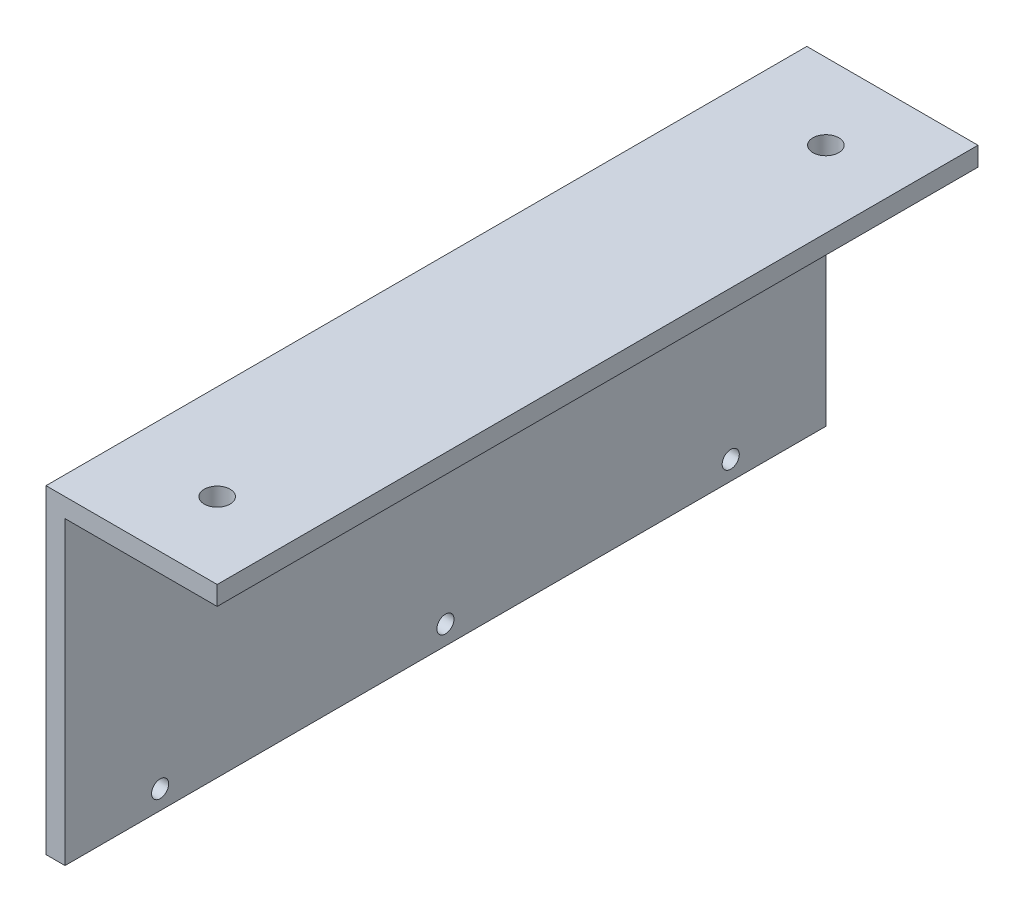
ISO-10303-21;
HEADER;
FILE_DESCRIPTION(('STEP AP214'),'2;1');
FILE_NAME('part.step','',(''),(''),'','','');
FILE_SCHEMA(('AUTOMOTIVE_DESIGN { 1 0 10303 214 1 1 1 1 }'));
ENDSEC;
DATA;
#1=APPLICATION_CONTEXT('core data for automotive mechanical design processes');
#2=APPLICATION_PROTOCOL_DEFINITION('international standard','automotive_design',2000,#1);
#3=PRODUCT_CONTEXT('',#1,'mechanical');
#4=PRODUCT('Part','Part','',(#3));
#5=PRODUCT_RELATED_PRODUCT_CATEGORY('part','',(#4));
#6=PRODUCT_DEFINITION_FORMATION('','',#4);
#7=PRODUCT_DEFINITION_CONTEXT('part definition',#1,'design');
#8=PRODUCT_DEFINITION('design','',#6,#7);
#9=PRODUCT_DEFINITION_SHAPE('','',#8);
#10=(LENGTH_UNIT() NAMED_UNIT(*) SI_UNIT(.MILLI.,.METRE.));
#11=(NAMED_UNIT(*) PLANE_ANGLE_UNIT() SI_UNIT($,.RADIAN.));
#12=(NAMED_UNIT(*) SI_UNIT($,.STERADIAN.) SOLID_ANGLE_UNIT());
#13=UNCERTAINTY_MEASURE_WITH_UNIT(LENGTH_MEASURE(1.E-05),#10,'distance_accuracy_value','');
#14=(GEOMETRIC_REPRESENTATION_CONTEXT(3) GLOBAL_UNCERTAINTY_ASSIGNED_CONTEXT((#13)) GLOBAL_UNIT_ASSIGNED_CONTEXT((#10,
#11,#12)) REPRESENTATION_CONTEXT('',''));
#15=CARTESIAN_POINT('',(0.,0.,0.));
#16=DIRECTION('',(0.,0.,1.));
#17=DIRECTION('',(1.,0.,0.));
#18=AXIS2_PLACEMENT_3D('',#15,#16,#17);
#19=CARTESIAN_POINT('',(0.,0.,200.));
#20=DIRECTION('',(0.,1.,0.));
#21=DIRECTION('',(0.,0.,1.));
#22=AXIS2_PLACEMENT_3D('',#19,#20,#21);
#23=PLANE('',#22);
#24=DIRECTION('',(1.,0.,0.));
#25=VECTOR('',#24,1.);
#26=CARTESIAN_POINT('',(0.,0.,0.));
#27=LINE('',#26,#25);
#28=CARTESIAN_POINT('',(0.,0.,0.));
#29=VERTEX_POINT('',#28);
#30=CARTESIAN_POINT('',(5.,0.,0.));
#31=VERTEX_POINT('',#30);
#32=EDGE_CURVE('E118',#29,#31,#27,.T.);
#33=ORIENTED_EDGE('',*,*,#32,.T.);
#34=DIRECTION('',(0.,0.,-1.));
#35=VECTOR('',#34,1.);
#36=CARTESIAN_POINT('',(5.,0.,200.));
#37=LINE('',#36,#35);
#38=CARTESIAN_POINT('',(5.,0.,200.));
#39=VERTEX_POINT('',#38);
#40=EDGE_CURVE('E11',#39,#31,#37,.T.);
#41=ORIENTED_EDGE('',*,*,#40,.F.);
#42=DIRECTION('',(1.,0.,0.));
#43=VECTOR('',#42,1.);
#44=CARTESIAN_POINT('',(0.,0.,200.));
#45=LINE('',#44,#43);
#46=CARTESIAN_POINT('',(0.,0.,200.));
#47=VERTEX_POINT('',#46);
#48=EDGE_CURVE('E129',#47,#39,#45,.T.);
#49=ORIENTED_EDGE('',*,*,#48,.F.);
#50=DIRECTION('',(0.,0.,-1.));
#51=VECTOR('',#50,1.);
#52=CARTESIAN_POINT('',(0.,0.,200.));
#53=LINE('',#52,#51);
#54=EDGE_CURVE('E114',#47,#29,#53,.T.);
#55=ORIENTED_EDGE('',*,*,#54,.T.);
#56=EDGE_LOOP('',(#33,#41,#49,#55));
#57=FACE_BOUND('',#56,.T.);
#58=ADVANCED_FACE('F34',(#57),#23,.F.);
#59=CARTESIAN_POINT('',(5.,0.,200.));
#60=DIRECTION('',(-1.,0.,0.));
#61=DIRECTION('',(0.,0.,1.));
#62=AXIS2_PLACEMENT_3D('',#59,#60,#61);
#63=PLANE('',#62);
#64=CARTESIAN_POINT('',(5.,5.00000000000002,175.000000000003));
#65=DIRECTION('',(-1.,0.,0.));
#66=DIRECTION('',(0.,0.,1.));
#67=AXIS2_PLACEMENT_3D('',#64,#65,#66);
#68=CIRCLE('',#67,2.24999999999999);
#69=CARTESIAN_POINT('',(5.,5.00000000000002,177.250000000003));
#70=VERTEX_POINT('',#69);
#71=EDGE_CURVE('E271',#70,#70,#68,.T.);
#72=ORIENTED_EDGE('',*,*,#71,.T.);
#73=EDGE_LOOP('',(#72));
#74=FACE_BOUND('',#73,.T.);
#75=CARTESIAN_POINT('',(5.,5.,100.));
#76=DIRECTION('',(-1.,0.,0.));
#77=DIRECTION('',(0.,0.,1.));
#78=AXIS2_PLACEMENT_3D('',#75,#76,#77);
#79=CIRCLE('',#78,2.24999999999999);
#80=CARTESIAN_POINT('',(5.,5.,102.25));
#81=VERTEX_POINT('',#80);
#82=EDGE_CURVE('E275',#81,#81,#79,.T.);
#83=ORIENTED_EDGE('',*,*,#82,.T.);
#84=EDGE_LOOP('',(#83));
#85=FACE_BOUND('',#84,.T.);
#86=CARTESIAN_POINT('',(5.,5.,24.9999999999969));
#87=DIRECTION('',(-1.,0.,0.));
#88=DIRECTION('',(0.,0.,1.));
#89=AXIS2_PLACEMENT_3D('',#86,#87,#88);
#90=CIRCLE('',#89,2.24999999999999);
#91=CARTESIAN_POINT('',(5.,5.,27.2499999999969));
#92=VERTEX_POINT('',#91);
#93=EDGE_CURVE('E284',#92,#92,#90,.T.);
#94=ORIENTED_EDGE('',*,*,#93,.T.);
#95=EDGE_LOOP('',(#94));
#96=FACE_BOUND('',#95,.T.);
#97=DIRECTION('',(0.,1.,0.));
#98=VECTOR('',#97,1.);
#99=CARTESIAN_POINT('',(5.,0.,0.));
#100=LINE('',#99,#98);
#101=CARTESIAN_POINT('',(5.,79.,0.));
#102=VERTEX_POINT('',#101);
#103=EDGE_CURVE('E121',#31,#102,#100,.T.);
#104=ORIENTED_EDGE('',*,*,#103,.T.);
#105=DIRECTION('',(0.,0.,-1.));
#106=VECTOR('',#105,1.);
#107=CARTESIAN_POINT('',(5.,79.,200.));
#108=LINE('',#107,#106);
#109=CARTESIAN_POINT('',(5.,79.,200.));
#110=VERTEX_POINT('',#109);
#111=EDGE_CURVE('E42',#110,#102,#108,.T.);
#112=ORIENTED_EDGE('',*,*,#111,.F.);
#113=DIRECTION('',(0.,1.,0.));
#114=VECTOR('',#113,1.);
#115=CARTESIAN_POINT('',(5.,0.,200.));
#116=LINE('',#115,#114);
#117=EDGE_CURVE('E87',#39,#110,#116,.T.);
#118=ORIENTED_EDGE('',*,*,#117,.F.);
#119=ORIENTED_EDGE('',*,*,#40,.T.);
#120=EDGE_LOOP('',(#104,#112,#118,#119));
#121=FACE_BOUND('',#120,.T.);
#122=ADVANCED_FACE('F157',(#74,#85,#96,#121),#63,.F.);
#123=CARTESIAN_POINT('',(5.,79.,200.));
#124=DIRECTION('',(0.,1.,0.));
#125=DIRECTION('',(0.,0.,1.));
#126=AXIS2_PLACEMENT_3D('',#123,#124,#125);
#127=PLANE('',#126);
#128=CARTESIAN_POINT('',(25.,79.,180.));
#129=DIRECTION('',(0.,-1.,0.));
#130=DIRECTION('',(0.,0.,-1.));
#131=AXIS2_PLACEMENT_3D('',#128,#129,#130);
#132=CIRCLE('',#131,3.39999999999999);
#133=CARTESIAN_POINT('',(25.,79.,176.6));
#134=VERTEX_POINT('',#133);
#135=EDGE_CURVE('E287',#134,#134,#132,.T.);
#136=ORIENTED_EDGE('',*,*,#135,.F.);
#137=EDGE_LOOP('',(#136));
#138=FACE_BOUND('',#137,.T.);
#139=CARTESIAN_POINT('',(25.,79.,20.));
#140=DIRECTION('',(0.,-1.,0.));
#141=DIRECTION('',(0.,0.,-1.));
#142=AXIS2_PLACEMENT_3D('',#139,#140,#141);
#143=CIRCLE('',#142,3.39999999999999);
#144=CARTESIAN_POINT('',(25.,79.,16.6));
#145=VERTEX_POINT('',#144);
#146=EDGE_CURVE('E293',#145,#145,#143,.T.);
#147=ORIENTED_EDGE('',*,*,#146,.F.);
#148=EDGE_LOOP('',(#147));
#149=FACE_BOUND('',#148,.T.);
#150=DIRECTION('',(1.,0.,0.));
#151=VECTOR('',#150,1.);
#152=CARTESIAN_POINT('',(5.,79.,0.));
#153=LINE('',#152,#151);
#154=CARTESIAN_POINT('',(45.,79.,0.));
#155=VERTEX_POINT('',#154);
#156=EDGE_CURVE('E124',#102,#155,#153,.T.);
#157=ORIENTED_EDGE('',*,*,#156,.T.);
#158=DIRECTION('',(0.,0.,-1.));
#159=VECTOR('',#158,1.);
#160=CARTESIAN_POINT('',(45.,79.,200.));
#161=LINE('',#160,#159);
#162=CARTESIAN_POINT('',(45.,79.,200.));
#163=VERTEX_POINT('',#162);
#164=EDGE_CURVE('E109',#163,#155,#161,.T.);
#165=ORIENTED_EDGE('',*,*,#164,.F.);
#166=DIRECTION('',(1.,0.,0.));
#167=VECTOR('',#166,1.);
#168=CARTESIAN_POINT('',(5.,79.,200.));
#169=LINE('',#168,#167);
#170=EDGE_CURVE('E100',#110,#163,#169,.T.);
#171=ORIENTED_EDGE('',*,*,#170,.F.);
#172=ORIENTED_EDGE('',*,*,#111,.T.);
#173=EDGE_LOOP('',(#157,#165,#171,#172));
#174=FACE_BOUND('',#173,.T.);
#175=ADVANCED_FACE('F135',(#138,#149,#174),#127,.F.);
#176=CARTESIAN_POINT('',(45.,79.,200.));
#177=DIRECTION('',(-1.,0.,0.));
#178=DIRECTION('',(0.,0.,1.));
#179=AXIS2_PLACEMENT_3D('',#176,#177,#178);
#180=PLANE('',#179);
#181=DIRECTION('',(0.,1.,0.));
#182=VECTOR('',#181,1.);
#183=CARTESIAN_POINT('',(45.,79.,0.));
#184=LINE('',#183,#182);
#185=CARTESIAN_POINT('',(45.,84.,0.));
#186=VERTEX_POINT('',#185);
#187=EDGE_CURVE('E108',#155,#186,#184,.T.);
#188=ORIENTED_EDGE('',*,*,#187,.T.);
#189=DIRECTION('',(0.,0.,-1.));
#190=VECTOR('',#189,1.);
#191=CARTESIAN_POINT('',(45.,84.,200.));
#192=LINE('',#191,#190);
#193=CARTESIAN_POINT('',(45.,84.,200.));
#194=VERTEX_POINT('',#193);
#195=EDGE_CURVE('E105',#194,#186,#192,.T.);
#196=ORIENTED_EDGE('',*,*,#195,.F.);
#197=DIRECTION('',(0.,1.,0.));
#198=VECTOR('',#197,1.);
#199=CARTESIAN_POINT('',(45.,79.,200.));
#200=LINE('',#199,#198);
#201=EDGE_CURVE('E94',#163,#194,#200,.T.);
#202=ORIENTED_EDGE('',*,*,#201,.F.);
#203=ORIENTED_EDGE('',*,*,#164,.T.);
#204=EDGE_LOOP('',(#188,#196,#202,#203));
#205=FACE_BOUND('',#204,.T.);
#206=ADVANCED_FACE('F106',(#205),#180,.F.);
#207=CARTESIAN_POINT('',(0.,84.,200.));
#208=DIRECTION('',(0.,-1.,0.));
#209=DIRECTION('',(0.,0.,-1.));
#210=AXIS2_PLACEMENT_3D('',#207,#208,#209);
#211=PLANE('',#210);
#212=CARTESIAN_POINT('',(25.,84.,180.));
#213=DIRECTION('',(0.,-1.,0.));
#214=DIRECTION('',(0.,0.,-1.));
#215=AXIS2_PLACEMENT_3D('',#212,#213,#214);
#216=CIRCLE('',#215,3.39999999999999);
#217=CARTESIAN_POINT('',(25.,84.,176.6));
#218=VERTEX_POINT('',#217);
#219=EDGE_CURVE('E290',#218,#218,#216,.T.);
#220=ORIENTED_EDGE('',*,*,#219,.T.);
#221=EDGE_LOOP('',(#220));
#222=FACE_BOUND('',#221,.T.);
#223=CARTESIAN_POINT('',(25.,84.,20.));
#224=DIRECTION('',(0.,-1.,0.));
#225=DIRECTION('',(0.,0.,-1.));
#226=AXIS2_PLACEMENT_3D('',#223,#224,#225);
#227=CIRCLE('',#226,3.39999999999999);
#228=CARTESIAN_POINT('',(25.,84.,16.6));
#229=VERTEX_POINT('',#228);
#230=EDGE_CURVE('E122',#229,#229,#227,.T.);
#231=ORIENTED_EDGE('',*,*,#230,.T.);
#232=EDGE_LOOP('',(#231));
#233=FACE_BOUND('',#232,.T.);
#234=DIRECTION('',(-1.,0.,0.));
#235=VECTOR('',#234,1.);
#236=CARTESIAN_POINT('',(0.,84.,0.));
#237=LINE('',#236,#235);
#238=CARTESIAN_POINT('',(0.,84.,0.));
#239=VERTEX_POINT('',#238);
#240=EDGE_CURVE('E73',#186,#239,#237,.T.);
#241=ORIENTED_EDGE('',*,*,#240,.T.);
#242=DIRECTION('',(0.,0.,-1.));
#243=VECTOR('',#242,1.);
#244=CARTESIAN_POINT('',(0.,84.,200.));
#245=LINE('',#244,#243);
#246=CARTESIAN_POINT('',(0.,84.,200.));
#247=VERTEX_POINT('',#246);
#248=EDGE_CURVE('E110',#247,#239,#245,.T.);
#249=ORIENTED_EDGE('',*,*,#248,.F.);
#250=DIRECTION('',(-1.,0.,0.));
#251=VECTOR('',#250,1.);
#252=CARTESIAN_POINT('',(0.,84.,200.));
#253=LINE('',#252,#251);
#254=EDGE_CURVE('E98',#194,#247,#253,.T.);
#255=ORIENTED_EDGE('',*,*,#254,.F.);
#256=ORIENTED_EDGE('',*,*,#195,.T.);
#257=EDGE_LOOP('',(#241,#249,#255,#256));
#258=FACE_BOUND('',#257,.T.);
#259=ADVANCED_FACE('F112',(#222,#233,#258),#211,.F.);
#260=CARTESIAN_POINT('',(0.,0.,200.));
#261=DIRECTION('',(1.,0.,0.));
#262=DIRECTION('',(0.,0.,-1.));
#263=AXIS2_PLACEMENT_3D('',#260,#261,#262);
#264=PLANE('',#263);
#265=CARTESIAN_POINT('',(0.,5.00000000000002,175.000000000003));
#266=DIRECTION('',(-1.,0.,0.));
#267=DIRECTION('',(0.,0.,1.));
#268=AXIS2_PLACEMENT_3D('',#265,#266,#267);
#269=CIRCLE('',#268,2.24999999999999);
#270=CARTESIAN_POINT('',(0.,5.00000000000002,177.250000000003));
#271=VERTEX_POINT('',#270);
#272=EDGE_CURVE('E269',#271,#271,#269,.T.);
#273=ORIENTED_EDGE('',*,*,#272,.F.);
#274=EDGE_LOOP('',(#273));
#275=FACE_BOUND('',#274,.T.);
#276=CARTESIAN_POINT('',(0.,5.,100.));
#277=DIRECTION('',(-1.,0.,0.));
#278=DIRECTION('',(0.,0.,1.));
#279=AXIS2_PLACEMENT_3D('',#276,#277,#278);
#280=CIRCLE('',#279,2.24999999999999);
#281=CARTESIAN_POINT('',(0.,5.,102.25));
#282=VERTEX_POINT('',#281);
#283=EDGE_CURVE('E272',#282,#282,#280,.T.);
#284=ORIENTED_EDGE('',*,*,#283,.F.);
#285=EDGE_LOOP('',(#284));
#286=FACE_BOUND('',#285,.T.);
#287=CARTESIAN_POINT('',(0.,5.,24.9999999999969));
#288=DIRECTION('',(-1.,0.,0.));
#289=DIRECTION('',(0.,0.,1.));
#290=AXIS2_PLACEMENT_3D('',#287,#288,#289);
#291=CIRCLE('',#290,2.24999999999999);
#292=CARTESIAN_POINT('',(0.,5.,27.2499999999969));
#293=VERTEX_POINT('',#292);
#294=EDGE_CURVE('E281',#293,#293,#291,.T.);
#295=ORIENTED_EDGE('',*,*,#294,.F.);
#296=EDGE_LOOP('',(#295));
#297=FACE_BOUND('',#296,.T.);
#298=DIRECTION('',(0.,-1.,0.));
#299=VECTOR('',#298,1.);
#300=CARTESIAN_POINT('',(0.,0.,0.));
#301=LINE('',#300,#299);
#302=EDGE_CURVE('E79',#239,#29,#301,.T.);
#303=ORIENTED_EDGE('',*,*,#302,.T.);
#304=ORIENTED_EDGE('',*,*,#54,.F.);
#305=DIRECTION('',(0.,-1.,0.));
#306=VECTOR('',#305,1.);
#307=CARTESIAN_POINT('',(0.,0.,200.));
#308=LINE('',#307,#306);
#309=EDGE_CURVE('E50',#247,#47,#308,.T.);
#310=ORIENTED_EDGE('',*,*,#309,.F.);
#311=ORIENTED_EDGE('',*,*,#248,.T.);
#312=EDGE_LOOP('',(#303,#304,#310,#311));
#313=FACE_BOUND('',#312,.T.);
#314=ADVANCED_FACE('F142',(#275,#286,#297,#313),#264,.F.);
#315=CARTESIAN_POINT('',(0.,0.,200.));
#316=DIRECTION('',(0.,0.,1.));
#317=DIRECTION('',(1.,0.,0.));
#318=AXIS2_PLACEMENT_3D('',#315,#316,#317);
#319=PLANE('',#318);
#320=ORIENTED_EDGE('',*,*,#48,.T.);
#321=ORIENTED_EDGE('',*,*,#117,.T.);
#322=ORIENTED_EDGE('',*,*,#170,.T.);
#323=ORIENTED_EDGE('',*,*,#201,.T.);
#324=ORIENTED_EDGE('',*,*,#254,.T.);
#325=ORIENTED_EDGE('',*,*,#309,.T.);
#326=EDGE_LOOP('',(#320,#321,#322,#323,#324,#325));
#327=FACE_BOUND('',#326,.T.);
#328=ADVANCED_FACE('F96',(#327),#319,.T.);
#329=CARTESIAN_POINT('',(0.,0.,0.));
#330=DIRECTION('',(0.,0.,1.));
#331=DIRECTION('',(1.,0.,0.));
#332=AXIS2_PLACEMENT_3D('',#329,#330,#331);
#333=PLANE('',#332);
#334=ORIENTED_EDGE('',*,*,#32,.F.);
#335=ORIENTED_EDGE('',*,*,#302,.F.);
#336=ORIENTED_EDGE('',*,*,#240,.F.);
#337=ORIENTED_EDGE('',*,*,#187,.F.);
#338=ORIENTED_EDGE('',*,*,#156,.F.);
#339=ORIENTED_EDGE('',*,*,#103,.F.);
#340=EDGE_LOOP('',(#334,#335,#336,#337,#338,#339));
#341=FACE_BOUND('',#340,.T.);
#342=ADVANCED_FACE('F138',(#341),#333,.F.);
#343=CARTESIAN_POINT('',(25.,79.,20.));
#344=DIRECTION('',(0.,-1.,0.));
#345=DIRECTION('',(0.,0.,-1.));
#346=AXIS2_PLACEMENT_3D('',#343,#344,#345);
#347=CYLINDRICAL_SURFACE('',#346,3.39999999999999);
#348=ORIENTED_EDGE('',*,*,#230,.F.);
#349=EDGE_LOOP('',(#348));
#350=FACE_BOUND('',#349,.T.);
#351=ORIENTED_EDGE('',*,*,#146,.T.);
#352=EDGE_LOOP('',(#351));
#353=FACE_BOUND('',#352,.T.);
#354=ADVANCED_FACE('F189',(#350,#353),#347,.F.);
#355=CARTESIAN_POINT('',(25.,79.,180.));
#356=DIRECTION('',(0.,-1.,0.));
#357=DIRECTION('',(0.,0.,-1.));
#358=AXIS2_PLACEMENT_3D('',#355,#356,#357);
#359=CYLINDRICAL_SURFACE('',#358,3.39999999999999);
#360=ORIENTED_EDGE('',*,*,#219,.F.);
#361=EDGE_LOOP('',(#360));
#362=FACE_BOUND('',#361,.T.);
#363=ORIENTED_EDGE('',*,*,#135,.T.);
#364=EDGE_LOOP('',(#363));
#365=FACE_BOUND('',#364,.T.);
#366=ADVANCED_FACE('F195',(#362,#365),#359,.F.);
#367=CARTESIAN_POINT('',(0.,5.,24.9999999999969));
#368=DIRECTION('',(-1.,0.,0.));
#369=DIRECTION('',(0.,0.,1.));
#370=AXIS2_PLACEMENT_3D('',#367,#368,#369);
#371=CYLINDRICAL_SURFACE('',#370,2.24999999999999);
#372=ORIENTED_EDGE('',*,*,#294,.T.);
#373=EDGE_LOOP('',(#372));
#374=FACE_BOUND('',#373,.T.);
#375=ORIENTED_EDGE('',*,*,#93,.F.);
#376=EDGE_LOOP('',(#375));
#377=FACE_BOUND('',#376,.T.);
#378=ADVANCED_FACE('F207',(#374,#377),#371,.F.);
#379=CARTESIAN_POINT('',(0.,5.,100.));
#380=DIRECTION('',(-1.,0.,0.));
#381=DIRECTION('',(0.,0.,1.));
#382=AXIS2_PLACEMENT_3D('',#379,#380,#381);
#383=CYLINDRICAL_SURFACE('',#382,2.24999999999999);
#384=ORIENTED_EDGE('',*,*,#283,.T.);
#385=EDGE_LOOP('',(#384));
#386=FACE_BOUND('',#385,.T.);
#387=ORIENTED_EDGE('',*,*,#82,.F.);
#388=EDGE_LOOP('',(#387));
#389=FACE_BOUND('',#388,.T.);
#390=ADVANCED_FACE('F228',(#386,#389),#383,.F.);
#391=CARTESIAN_POINT('',(0.,5.00000000000002,175.000000000003));
#392=DIRECTION('',(-1.,0.,0.));
#393=DIRECTION('',(0.,0.,1.));
#394=AXIS2_PLACEMENT_3D('',#391,#392,#393);
#395=CYLINDRICAL_SURFACE('',#394,2.24999999999999);
#396=ORIENTED_EDGE('',*,*,#272,.T.);
#397=EDGE_LOOP('',(#396));
#398=FACE_BOUND('',#397,.T.);
#399=ORIENTED_EDGE('',*,*,#71,.F.);
#400=EDGE_LOOP('',(#399));
#401=FACE_BOUND('',#400,.T.);
#402=ADVANCED_FACE('F239',(#398,#401),#395,.F.);
#403=CLOSED_SHELL('',(#58,#122,#175,#206,#259,#314,#328,#342,#354,#366,#378,#390,#402));
#404=MANIFOLD_SOLID_BREP('B2',#403);
#405=ADVANCED_BREP_SHAPE_REPRESENTATION('',(#18,#404),#14);
#406=SHAPE_DEFINITION_REPRESENTATION(#9,#405);
ENDSEC;
END-ISO-10303-21;
